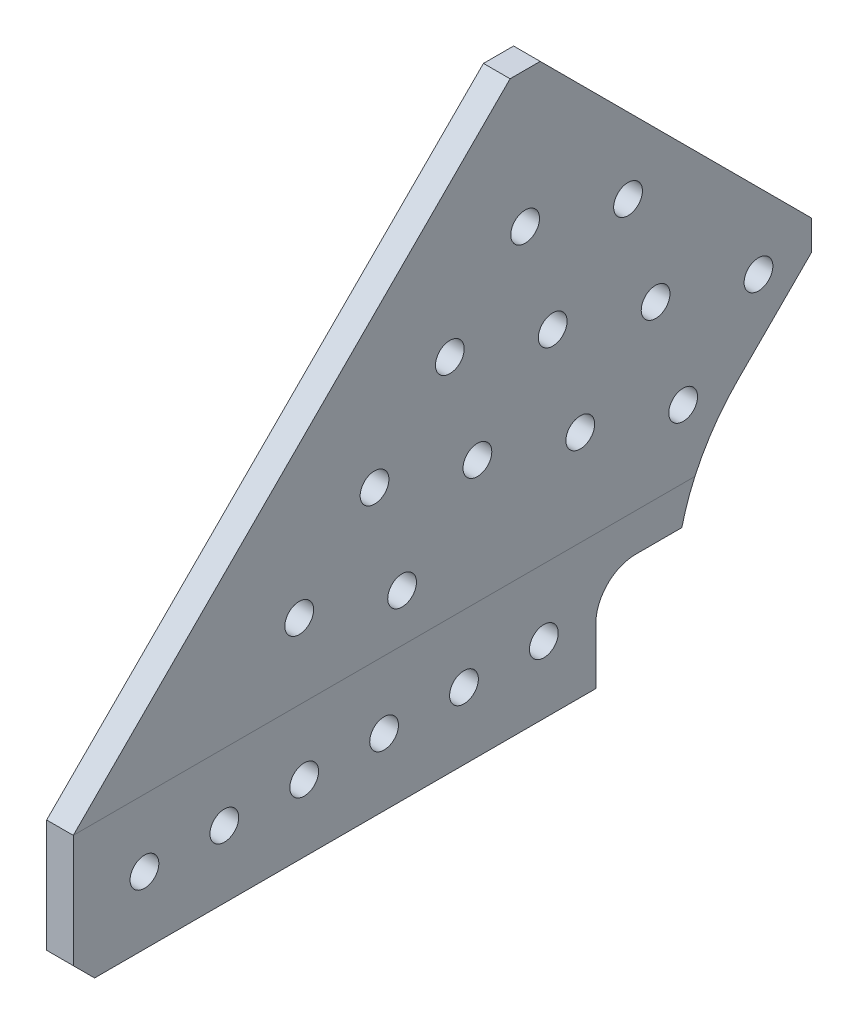
ISO-10303-21;
HEADER;
FILE_DESCRIPTION(('STEP AP214'),'2;1');
FILE_NAME('part.step','',(''),(''),'','','');
FILE_SCHEMA(('AUTOMOTIVE_DESIGN { 1 0 10303 214 1 1 1 1 }'));
ENDSEC;
DATA;
#1=APPLICATION_CONTEXT('core data for automotive mechanical design processes');
#2=APPLICATION_PROTOCOL_DEFINITION('international standard','automotive_design',2000,#1);
#3=PRODUCT_CONTEXT('',#1,'mechanical');
#4=PRODUCT('Part','Part','',(#3));
#5=PRODUCT_RELATED_PRODUCT_CATEGORY('part','',(#4));
#6=PRODUCT_DEFINITION_FORMATION('','',#4);
#7=PRODUCT_DEFINITION_CONTEXT('part definition',#1,'design');
#8=PRODUCT_DEFINITION('design','',#6,#7);
#9=PRODUCT_DEFINITION_SHAPE('','',#8);
#10=(LENGTH_UNIT() NAMED_UNIT(*) SI_UNIT(.MILLI.,.METRE.));
#11=(NAMED_UNIT(*) PLANE_ANGLE_UNIT() SI_UNIT($,.RADIAN.));
#12=(NAMED_UNIT(*) SI_UNIT($,.STERADIAN.) SOLID_ANGLE_UNIT());
#13=UNCERTAINTY_MEASURE_WITH_UNIT(LENGTH_MEASURE(1.E-05),#10,'distance_accuracy_value','');
#14=(GEOMETRIC_REPRESENTATION_CONTEXT(3) GLOBAL_UNCERTAINTY_ASSIGNED_CONTEXT((#13)) GLOBAL_UNIT_ASSIGNED_CONTEXT((#10,
#11,#12)) REPRESENTATION_CONTEXT('',''));
#15=CARTESIAN_POINT('',(0.,0.,0.));
#16=DIRECTION('',(0.,0.,1.));
#17=DIRECTION('',(1.,0.,0.));
#18=AXIS2_PLACEMENT_3D('',#15,#16,#17);
#19=CARTESIAN_POINT('',(3.175,5.48097551572336,-25.4));
#20=DIRECTION('',(1.,0.,0.));
#21=DIRECTION('',(0.,0.,-1.));
#22=AXIS2_PLACEMENT_3D('',#19,#20,#21);
#23=PLANE('',#22);
#24=DIRECTION('',(0.,0.,1.));
#25=VECTOR('',#24,1.);
#26=CARTESIAN_POINT('',(3.175,11.4935000000015,4.77130668799723));
#27=LINE('',#26,#25);
#28=CARTESIAN_POINT('',(3.175,11.4935000000015,-0.721881163144627));
#29=VERTEX_POINT('',#28);
#30=CARTESIAN_POINT('',(3.175,11.4935000000015,4.77130668799723));
#31=VERTEX_POINT('',#30);
#32=EDGE_CURVE('E183',#29,#31,#27,.T.);
#33=ORIENTED_EDGE('',*,*,#32,.F.);
#34=CARTESIAN_POINT('',(3.175,5.48097551572336,-25.4));
#35=DIRECTION('',(-1.,0.,0.));
#36=DIRECTION('',(0.,0.,-1.));
#37=AXIS2_PLACEMENT_3D('',#34,#35,#36);
#38=CIRCLE('',#37,25.4);
#39=CARTESIAN_POINT('',(3.175,16.002,-2.28143508343886));
#40=VERTEX_POINT('',#39);
#41=EDGE_CURVE('E355',#29,#40,#38,.T.);
#42=ORIENTED_EDGE('',*,*,#41,.T.);
#43=DIRECTION('',(0.,0.,1.));
#44=VECTOR('',#43,1.);
#45=CARTESIAN_POINT('',(3.175,16.002,-25.4));
#46=LINE('',#45,#44);
#47=CARTESIAN_POINT('',(3.175,16.002,71.8420489685533));
#48=VERTEX_POINT('',#47);
#49=EDGE_CURVE('E398',#40,#48,#46,.T.);
#50=ORIENTED_EDGE('',*,*,#49,.T.);
#51=DIRECTION('',(0.,-1.,0.));
#52=VECTOR('',#51,1.);
#53=CARTESIAN_POINT('',(3.175,16.002,71.8420489685533));
#54=LINE('',#53,#52);
#55=CARTESIAN_POINT('',(3.175,2.53999999999998,71.8420489685534));
#56=VERTEX_POINT('',#55);
#57=EDGE_CURVE('E369',#48,#56,#54,.T.);
#58=ORIENTED_EDGE('',*,*,#57,.T.);
#59=DIRECTION('',(0.,0.707106781186549,0.707106781186546));
#60=VECTOR('',#59,1.);
#61=CARTESIAN_POINT('',(3.175,-44.610536726415,24.6915122421386));
#62=LINE('',#61,#60);
#63=CARTESIAN_POINT('',(3.175,0.,69.3020489685534));
#64=VERTEX_POINT('',#63);
#65=EDGE_CURVE('E63',#56,#64,#62,.F.);
#66=ORIENTED_EDGE('',*,*,#65,.T.);
#67=DIRECTION('',(0.,0.,-1.));
#68=VECTOR('',#67,1.);
#69=CARTESIAN_POINT('',(3.175,0.,71.8420489685534));
#70=LINE('',#69,#68);
#71=CARTESIAN_POINT('',(3.175,0.,9.53380668799723));
#72=VERTEX_POINT('',#71);
#73=EDGE_CURVE('E349',#64,#72,#70,.T.);
#74=ORIENTED_EDGE('',*,*,#73,.T.);
#75=DIRECTION('',(0.,-1.,0.));
#76=VECTOR('',#75,1.);
#77=CARTESIAN_POINT('',(3.175,6.73100000000149,9.53380668799723));
#78=LINE('',#77,#76);
#79=CARTESIAN_POINT('',(3.175,6.73100000000149,9.53380668799723));
#80=VERTEX_POINT('',#79);
#81=EDGE_CURVE('E189',#80,#72,#78,.T.);
#82=ORIENTED_EDGE('',*,*,#81,.F.);
#83=CARTESIAN_POINT('',(3.175,6.73100000000149,4.77130668799723));
#84=DIRECTION('',(1.,0.,0.));
#85=DIRECTION('',(0.,0.,-1.));
#86=AXIS2_PLACEMENT_3D('',#83,#84,#85);
#87=CIRCLE('',#86,4.7625);
#88=EDGE_CURVE('E168',#31,#80,#87,.T.);
#89=ORIENTED_EDGE('',*,*,#88,.F.);
#90=EDGE_LOOP('',(#33,#42,#50,#58,#66,#74,#82,#89));
#91=FACE_BOUND('',#90,.T.);
#92=CARTESIAN_POINT('',(3.175,8.001,15.7303069425573));
#93=DIRECTION('',(1.,0.,0.));
#94=DIRECTION('',(0.,1.,0.));
#95=AXIS2_PLACEMENT_3D('',#92,#93,#94);
#96=CIRCLE('',#95,1.7145);
#97=CARTESIAN_POINT('',(3.175,9.7155,15.7303069425573));
#98=VERTEX_POINT('',#97);
#99=EDGE_CURVE('E307',#98,#98,#96,.T.);
#100=ORIENTED_EDGE('',*,*,#99,.F.);
#101=EDGE_LOOP('',(#100));
#102=FACE_BOUND('',#101,.T.);
#103=CARTESIAN_POINT('',(3.175,8.001,25.2553069425573));
#104=DIRECTION('',(1.,0.,0.));
#105=DIRECTION('',(0.,1.,0.));
#106=AXIS2_PLACEMENT_3D('',#103,#104,#105);
#107=CIRCLE('',#106,1.7145);
#108=CARTESIAN_POINT('',(3.175,9.7155,25.2553069425573));
#109=VERTEX_POINT('',#108);
#110=EDGE_CURVE('E315',#109,#109,#107,.T.);
#111=ORIENTED_EDGE('',*,*,#110,.F.);
#112=EDGE_LOOP('',(#111));
#113=FACE_BOUND('',#112,.T.);
#114=CARTESIAN_POINT('',(3.175,8.001,34.7803069425573));
#115=DIRECTION('',(1.,0.,0.));
#116=DIRECTION('',(0.,1.,0.));
#117=AXIS2_PLACEMENT_3D('',#114,#115,#116);
#118=CIRCLE('',#117,1.7145);
#119=CARTESIAN_POINT('',(3.175,9.7155,34.7803069425573));
#120=VERTEX_POINT('',#119);
#121=EDGE_CURVE('E322',#120,#120,#118,.T.);
#122=ORIENTED_EDGE('',*,*,#121,.F.);
#123=EDGE_LOOP('',(#122));
#124=FACE_BOUND('',#123,.T.);
#125=CARTESIAN_POINT('',(3.175,8.001,44.3053069425572));
#126=DIRECTION('',(1.,0.,0.));
#127=DIRECTION('',(0.,1.,0.));
#128=AXIS2_PLACEMENT_3D('',#125,#126,#127);
#129=CIRCLE('',#128,1.7145);
#130=CARTESIAN_POINT('',(3.175,9.7155,44.3053069425572));
#131=VERTEX_POINT('',#130);
#132=EDGE_CURVE('E330',#131,#131,#129,.T.);
#133=ORIENTED_EDGE('',*,*,#132,.F.);
#134=EDGE_LOOP('',(#133));
#135=FACE_BOUND('',#134,.T.);
#136=CARTESIAN_POINT('',(3.175,8.001,53.8303069425572));
#137=DIRECTION('',(1.,0.,0.));
#138=DIRECTION('',(0.,1.,0.));
#139=AXIS2_PLACEMENT_3D('',#136,#137,#138);
#140=CIRCLE('',#139,1.7145);
#141=CARTESIAN_POINT('',(3.175,9.7155,53.8303069425572));
#142=VERTEX_POINT('',#141);
#143=EDGE_CURVE('E338',#142,#142,#140,.T.);
#144=ORIENTED_EDGE('',*,*,#143,.F.);
#145=EDGE_LOOP('',(#144));
#146=FACE_BOUND('',#145,.T.);
#147=CARTESIAN_POINT('',(3.175,8.001,63.3553069425571));
#148=DIRECTION('',(1.,0.,0.));
#149=DIRECTION('',(0.,1.,0.));
#150=AXIS2_PLACEMENT_3D('',#147,#148,#149);
#151=CIRCLE('',#150,1.7145);
#152=CARTESIAN_POINT('',(3.175,9.7155,63.3553069425571));
#153=VERTEX_POINT('',#152);
#154=EDGE_CURVE('E211',#153,#153,#151,.T.);
#155=ORIENTED_EDGE('',*,*,#154,.F.);
#156=EDGE_LOOP('',(#155));
#157=FACE_BOUND('',#156,.T.);
#158=ADVANCED_FACE('F53',(#91,#102,#113,#124,#135,#146,#157),#23,.T.);
#159=CARTESIAN_POINT('',(3.175,0.,71.8420489685534));
#160=DIRECTION('',(0.,1.,0.));
#161=DIRECTION('',(0.,0.,1.));
#162=AXIS2_PLACEMENT_3D('',#159,#160,#161);
#163=PLANE('',#162);
#164=DIRECTION('',(0.,0.,-1.));
#165=VECTOR('',#164,1.);
#166=CARTESIAN_POINT('',(0.,0.,71.8420489685534));
#167=LINE('',#166,#165);
#168=CARTESIAN_POINT('',(0.,0.,69.3020489685534));
#169=VERTEX_POINT('',#168);
#170=CARTESIAN_POINT('',(0.,0.,9.53380668799723));
#171=VERTEX_POINT('',#170);
#172=EDGE_CURVE('E306',#169,#171,#167,.T.);
#173=ORIENTED_EDGE('',*,*,#172,.T.);
#174=DIRECTION('',(1.,0.,0.));
#175=VECTOR('',#174,1.);
#176=CARTESIAN_POINT('',(0.,0.,9.53380668799723));
#177=LINE('',#176,#175);
#178=EDGE_CURVE('E73',#171,#72,#177,.T.);
#179=ORIENTED_EDGE('',*,*,#178,.T.);
#180=ORIENTED_EDGE('',*,*,#73,.F.);
#181=DIRECTION('',(-1.,0.,0.));
#182=VECTOR('',#181,1.);
#183=CARTESIAN_POINT('',(3.175,0.,69.3020489685534));
#184=LINE('',#183,#182);
#185=EDGE_CURVE('E428',#64,#169,#184,.T.);
#186=ORIENTED_EDGE('',*,*,#185,.T.);
#187=EDGE_LOOP('',(#173,#179,#180,#186));
#188=FACE_BOUND('',#187,.T.);
#189=ADVANCED_FACE('F443',(#188),#163,.F.);
#190=CARTESIAN_POINT('',(3.175,5.48097551572336,-25.4));
#191=DIRECTION('',(-1.,0.,0.));
#192=DIRECTION('',(0.,0.,1.));
#193=AXIS2_PLACEMENT_3D('',#190,#191,#192);
#194=CYLINDRICAL_SURFACE('',#193,25.4);
#195=ORIENTED_EDGE('',*,*,#41,.F.);
#196=DIRECTION('',(1.,0.,0.));
#197=VECTOR('',#196,1.);
#198=CARTESIAN_POINT('',(0.,11.4935000000015,-0.721881163144627));
#199=LINE('',#198,#197);
#200=CARTESIAN_POINT('',(0.,11.4935000000015,-0.721881163144627));
#201=VERTEX_POINT('',#200);
#202=EDGE_CURVE('E202',#201,#29,#199,.T.);
#203=ORIENTED_EDGE('',*,*,#202,.F.);
#204=CARTESIAN_POINT('',(0.,5.48097551572336,-25.4));
#205=DIRECTION('',(-1.,0.,0.));
#206=DIRECTION('',(0.,0.,-1.));
#207=AXIS2_PLACEMENT_3D('',#204,#205,#206);
#208=CIRCLE('',#207,25.4);
#209=CARTESIAN_POINT('',(0.,23.4414877578617,-7.43948775786172));
#210=VERTEX_POINT('',#209);
#211=EDGE_CURVE('E375',#201,#210,#208,.T.);
#212=ORIENTED_EDGE('',*,*,#211,.T.);
#213=DIRECTION('',(-1.,0.,0.));
#214=VECTOR('',#213,1.);
#215=CARTESIAN_POINT('',(3.175,23.4414877578617,-7.43948775786172));
#216=LINE('',#215,#214);
#217=CARTESIAN_POINT('',(3.175,23.4414877578617,-7.43948775786172));
#218=VERTEX_POINT('',#217);
#219=EDGE_CURVE('E394',#218,#210,#216,.T.);
#220=ORIENTED_EDGE('',*,*,#219,.F.);
#221=EDGE_CURVE('E353',#40,#218,#38,.T.);
#222=ORIENTED_EDGE('',*,*,#221,.F.);
#223=EDGE_LOOP('',(#195,#203,#212,#220,#222));
#224=FACE_BOUND('',#223,.T.);
#225=ADVANCED_FACE('F476',(#224),#194,.F.);
#226=CARTESIAN_POINT('',(3.175,23.4414877578617,-7.43948775786172));
#227=DIRECTION('',(0.,0.707106781186548,0.707106781186546));
#228=DIRECTION('',(0.,-0.707106781186547,0.707106781186549));
#229=AXIS2_PLACEMENT_3D('',#226,#227,#228);
#230=PLANE('',#229);
#231=DIRECTION('',(0.,0.707106781186546,-0.707106781186549));
#232=VECTOR('',#231,1.);
#233=CARTESIAN_POINT('',(0.,23.4414877578617,-7.43948775786172));
#234=LINE('',#233,#232);
#235=CARTESIAN_POINT('',(0.,32.1664610179245,-16.1644610179245));
#236=VERTEX_POINT('',#235);
#237=EDGE_CURVE('E378',#210,#236,#234,.T.);
#238=ORIENTED_EDGE('',*,*,#237,.T.);
#239=DIRECTION('',(1.,0.,0.));
#240=VECTOR('',#239,1.);
#241=CARTESIAN_POINT('',(3.175,32.1664610179245,-16.1644610179245));
#242=LINE('',#241,#240);
#243=CARTESIAN_POINT('',(3.175,32.1664610179245,-16.1644610179245));
#244=VERTEX_POINT('',#243);
#245=EDGE_CURVE('E12',#236,#244,#242,.T.);
#246=ORIENTED_EDGE('',*,*,#245,.T.);
#247=DIRECTION('',(0.,0.707106781186546,-0.707106781186549));
#248=VECTOR('',#247,1.);
#249=CARTESIAN_POINT('',(3.175,23.4414877578617,-7.43948775786172));
#250=LINE('',#249,#248);
#251=EDGE_CURVE('E358',#218,#244,#250,.T.);
#252=ORIENTED_EDGE('',*,*,#251,.F.);
#253=ORIENTED_EDGE('',*,*,#219,.T.);
#254=EDGE_LOOP('',(#238,#246,#252,#253));
#255=FACE_BOUND('',#254,.T.);
#256=ADVANCED_FACE('F470',(#255),#230,.F.);
#257=CARTESIAN_POINT('',(3.175,69.8835367264149,17.9605122421382));
#258=DIRECTION('',(0.,-0.707106781186547,0.707106781186548));
#259=DIRECTION('',(0.,-0.707106781186548,-0.707106781186547));
#260=AXIS2_PLACEMENT_3D('',#257,#258,#259);
#261=PLANE('',#260);
#262=DIRECTION('',(0.,0.707106781186548,0.707106781186547));
#263=VECTOR('',#262,1.);
#264=CARTESIAN_POINT('',(0.,69.8835367264149,17.9605122421382));
#265=LINE('',#264,#263);
#266=CARTESIAN_POINT('',(0.,35.7585634663521,-16.1644610179245));
#267=VERTEX_POINT('',#266);
#268=CARTESIAN_POINT('',(0.,68.0874855022011,16.1644610179244));
#269=VERTEX_POINT('',#268);
#270=EDGE_CURVE('E382',#267,#269,#265,.T.);
#271=ORIENTED_EDGE('',*,*,#270,.T.);
#272=DIRECTION('',(1.,0.,0.));
#273=VECTOR('',#272,1.);
#274=CARTESIAN_POINT('',(3.175,68.0874855022011,16.1644610179244));
#275=LINE('',#274,#273);
#276=CARTESIAN_POINT('',(3.175,68.0874855022011,16.1644610179244));
#277=VERTEX_POINT('',#276);
#278=EDGE_CURVE('E419',#269,#277,#275,.T.);
#279=ORIENTED_EDGE('',*,*,#278,.T.);
#280=DIRECTION('',(0.,0.707106781186548,0.707106781186547));
#281=VECTOR('',#280,1.);
#282=CARTESIAN_POINT('',(3.175,69.8835367264149,17.9605122421382));
#283=LINE('',#282,#281);
#284=CARTESIAN_POINT('',(3.175,35.7585634663521,-16.1644610179245));
#285=VERTEX_POINT('',#284);
#286=EDGE_CURVE('E362',#285,#277,#283,.T.);
#287=ORIENTED_EDGE('',*,*,#286,.F.);
#288=DIRECTION('',(-1.,0.,0.));
#289=VECTOR('',#288,1.);
#290=CARTESIAN_POINT('',(3.175,35.7585634663521,-16.1644610179245));
#291=LINE('',#290,#289);
#292=EDGE_CURVE('E415',#285,#267,#291,.T.);
#293=ORIENTED_EDGE('',*,*,#292,.T.);
#294=EDGE_LOOP('',(#271,#279,#287,#293));
#295=FACE_BOUND('',#294,.T.);
#296=ADVANCED_FACE('F457',(#295),#261,.F.);
#297=CARTESIAN_POINT('',(3.175,69.8835367264149,17.9605122421382));
#298=DIRECTION('',(0.,-0.707106781186549,-0.707106781186546));
#299=DIRECTION('',(0.,0.707106781186546,-0.707106781186549));
#300=AXIS2_PLACEMENT_3D('',#297,#298,#299);
#301=PLANE('',#300);
#302=DIRECTION('',(0.,-0.707106781186546,0.707106781186549));
#303=VECTOR('',#302,1.);
#304=CARTESIAN_POINT('',(3.175,69.8835367264149,17.9605122421382));
#305=LINE('',#304,#303);
#306=CARTESIAN_POINT('',(3.175,68.0874855022011,19.7565634663521));
#307=VERTEX_POINT('',#306);
#308=EDGE_CURVE('E366',#307,#48,#305,.T.);
#309=ORIENTED_EDGE('',*,*,#308,.F.);
#310=DIRECTION('',(-1.,0.,0.));
#311=VECTOR('',#310,1.);
#312=CARTESIAN_POINT('',(3.175,68.0874855022011,19.7565634663521));
#313=LINE('',#312,#311);
#314=CARTESIAN_POINT('',(0.,68.0874855022011,19.7565634663521));
#315=VERTEX_POINT('',#314);
#316=EDGE_CURVE('E402',#307,#315,#313,.T.);
#317=ORIENTED_EDGE('',*,*,#316,.T.);
#318=DIRECTION('',(0.,-0.707106781186546,0.707106781186549));
#319=VECTOR('',#318,1.);
#320=CARTESIAN_POINT('',(0.,69.8835367264149,17.9605122421382));
#321=LINE('',#320,#319);
#322=CARTESIAN_POINT('',(0.,16.002,71.8420489685533));
#323=VERTEX_POINT('',#322);
#324=EDGE_CURVE('E386',#315,#323,#321,.T.);
#325=ORIENTED_EDGE('',*,*,#324,.T.);
#326=DIRECTION('',(-1.,0.,0.));
#327=VECTOR('',#326,1.);
#328=CARTESIAN_POINT('',(3.175,16.002,71.8420489685533));
#329=LINE('',#328,#327);
#330=EDGE_CURVE('E372',#48,#323,#329,.T.);
#331=ORIENTED_EDGE('',*,*,#330,.F.);
#332=EDGE_LOOP('',(#309,#317,#325,#331));
#333=FACE_BOUND('',#332,.T.);
#334=ADVANCED_FACE('F451',(#333),#301,.F.);
#335=CARTESIAN_POINT('',(3.175,16.002,71.8420489685533));
#336=DIRECTION('',(0.,0.,-1.));
#337=DIRECTION('',(0.,1.,0.));
#338=AXIS2_PLACEMENT_3D('',#335,#336,#337);
#339=PLANE('',#338);
#340=DIRECTION('',(0.,-1.,0.));
#341=VECTOR('',#340,1.);
#342=CARTESIAN_POINT('',(0.,16.002,71.8420489685533));
#343=LINE('',#342,#341);
#344=CARTESIAN_POINT('',(0.,2.53999999999998,71.8420489685534));
#345=VERTEX_POINT('',#344);
#346=EDGE_CURVE('E354',#323,#345,#343,.T.);
#347=ORIENTED_EDGE('',*,*,#346,.T.);
#348=DIRECTION('',(1.,0.,0.));
#349=VECTOR('',#348,1.);
#350=CARTESIAN_POINT('',(3.175,2.53999999999998,71.8420489685534));
#351=LINE('',#350,#349);
#352=EDGE_CURVE('E81',#345,#56,#351,.T.);
#353=ORIENTED_EDGE('',*,*,#352,.T.);
#354=ORIENTED_EDGE('',*,*,#57,.F.);
#355=ORIENTED_EDGE('',*,*,#330,.T.);
#356=EDGE_LOOP('',(#347,#353,#354,#355));
#357=FACE_BOUND('',#356,.T.);
#358=ADVANCED_FACE('F447',(#357),#339,.F.);
#359=CARTESIAN_POINT('',(3.175,24.9822561210693,44.9012806053457));
#360=DIRECTION('',(1.,0.,0.));
#361=DIRECTION('',(0.,1.,0.));
#362=AXIS2_PLACEMENT_3D('',#359,#360,#361);
#363=CIRCLE('',#362,1.7145);
#364=CARTESIAN_POINT('',(3.175,26.6967561210693,44.9012806053457));
#365=VERTEX_POINT('',#364);
#366=EDGE_CURVE('E212',#365,#365,#363,.T.);
#367=ORIENTED_EDGE('',*,*,#366,.F.);
#368=EDGE_LOOP('',(#367));
#369=FACE_BOUND('',#368,.T.);
#370=CARTESIAN_POINT('',(3.175,36.3687646176033,2.40625237546517));
#371=DIRECTION('',(1.,0.,0.));
#372=DIRECTION('',(0.,1.,0.));
#373=AXIS2_PLACEMENT_3D('',#370,#371,#372);
#374=CIRCLE('',#373,1.7145);
#375=CARTESIAN_POINT('',(3.175,38.0832646176033,2.40625237546517));
#376=VERTEX_POINT('',#375);
#377=EDGE_CURVE('E230',#376,#376,#374,.T.);
#378=ORIENTED_EDGE('',*,*,#377,.F.);
#379=EDGE_LOOP('',(#378));
#380=FACE_BOUND('',#379,.T.);
#381=CARTESIAN_POINT('',(3.175,51.9230244842766,17.9605122421383));
#382=DIRECTION('',(1.,0.,0.));
#383=DIRECTION('',(0.,1.,0.));
#384=AXIS2_PLACEMENT_3D('',#381,#382,#383);
#385=CIRCLE('',#384,1.7145);
#386=CARTESIAN_POINT('',(3.175,53.6375244842766,17.9605122421383));
#387=VERTEX_POINT('',#386);
#388=EDGE_CURVE('E221',#387,#387,#385,.T.);
#389=ORIENTED_EDGE('',*,*,#388,.F.);
#390=EDGE_LOOP('',(#389));
#391=FACE_BOUND('',#390,.T.);
#392=CARTESIAN_POINT('',(3.175,48.6360226114745,5.69325424826719));
#393=DIRECTION('',(1.,0.,0.));
#394=DIRECTION('',(0.,1.,0.));
#395=AXIS2_PLACEMENT_3D('',#392,#393,#394);
#396=CIRCLE('',#395,1.7145);
#397=CARTESIAN_POINT('',(3.175,50.3505226114745,5.69325424826719));
#398=VERTEX_POINT('',#397);
#399=EDGE_CURVE('E201',#398,#398,#396,.T.);
#400=ORIENTED_EDGE('',*,*,#399,.F.);
#401=EDGE_LOOP('',(#400));
#402=FACE_BOUND('',#401,.T.);
#403=CARTESIAN_POINT('',(3.175,21.6952542482672,32.6340226114746));
#404=DIRECTION('',(1.,0.,0.));
#405=DIRECTION('',(0.,1.,0.));
#406=AXIS2_PLACEMENT_3D('',#403,#404,#405);
#407=CIRCLE('',#406,1.7145);
#408=CARTESIAN_POINT('',(3.175,23.4097542482672,32.6340226114746));
#409=VERTEX_POINT('',#408);
#410=EDGE_CURVE('E276',#409,#409,#407,.T.);
#411=ORIENTED_EDGE('',*,*,#410,.F.);
#412=EDGE_LOOP('',(#411));
#413=FACE_BOUND('',#412,.T.);
#414=CARTESIAN_POINT('',(3.175,30.6755103693363,23.6537664904055));
#415=DIRECTION('',(1.,0.,0.));
#416=DIRECTION('',(0.,1.,0.));
#417=AXIS2_PLACEMENT_3D('',#414,#415,#416);
#418=CIRCLE('',#417,1.7145);
#419=CARTESIAN_POINT('',(3.175,32.3900103693363,23.6537664904055));
#420=VERTEX_POINT('',#419);
#421=EDGE_CURVE('E284',#420,#420,#418,.T.);
#422=ORIENTED_EDGE('',*,*,#421,.F.);
#423=EDGE_LOOP('',(#422));
#424=FACE_BOUND('',#423,.T.);
#425=CARTESIAN_POINT('',(3.175,27.3885084965342,11.3865084965343));
#426=DIRECTION('',(1.,0.,0.));
#427=DIRECTION('',(0.,1.,0.));
#428=AXIS2_PLACEMENT_3D('',#425,#426,#427);
#429=CIRCLE('',#428,1.7145);
#430=CARTESIAN_POINT('',(3.175,29.1030084965342,11.3865084965343));
#431=VERTEX_POINT('',#430);
#432=EDGE_CURVE('E291',#431,#431,#429,.T.);
#433=ORIENTED_EDGE('',*,*,#432,.F.);
#434=EDGE_LOOP('',(#433));
#435=FACE_BOUND('',#434,.T.);
#436=CARTESIAN_POINT('',(3.175,24.1015066237322,-0.880749497336852));
#437=DIRECTION('',(1.,0.,0.));
#438=DIRECTION('',(0.,1.,0.));
#439=AXIS2_PLACEMENT_3D('',#436,#437,#438);
#440=CIRCLE('',#439,1.7145);
#441=CARTESIAN_POINT('',(3.175,25.8160066237322,-0.880749497336852));
#442=VERTEX_POINT('',#441);
#443=EDGE_CURVE('E245',#442,#442,#440,.T.);
#444=ORIENTED_EDGE('',*,*,#443,.F.);
#445=EDGE_LOOP('',(#444));
#446=FACE_BOUND('',#445,.T.);
#447=CARTESIAN_POINT('',(3.175,33.0817627448013,-9.86100561840598));
#448=DIRECTION('',(1.,0.,0.));
#449=DIRECTION('',(0.,1.,0.));
#450=AXIS2_PLACEMENT_3D('',#447,#448,#449);
#451=CIRCLE('',#450,1.7145);
#452=CARTESIAN_POINT('',(3.175,34.7962627448013,-9.86100561840598));
#453=VERTEX_POINT('',#452);
#454=EDGE_CURVE('E246',#453,#453,#451,.T.);
#455=ORIENTED_EDGE('',*,*,#454,.F.);
#456=EDGE_LOOP('',(#455));
#457=FACE_BOUND('',#456,.T.);
#458=CARTESIAN_POINT('',(3.175,33.9625122421384,35.9210244842766));
#459=DIRECTION('',(1.,0.,0.));
#460=DIRECTION('',(0.,1.,0.));
#461=AXIS2_PLACEMENT_3D('',#458,#459,#460);
#462=CIRCLE('',#461,1.7145);
#463=CARTESIAN_POINT('',(3.175,35.6770122421384,35.9210244842766));
#464=VERTEX_POINT('',#463);
#465=EDGE_CURVE('E254',#464,#464,#462,.T.);
#466=ORIENTED_EDGE('',*,*,#465,.F.);
#467=EDGE_LOOP('',(#466));
#468=FACE_BOUND('',#467,.T.);
#469=CARTESIAN_POINT('',(3.175,42.9427683632075,26.9407683632075));
#470=DIRECTION('',(1.,0.,0.));
#471=DIRECTION('',(0.,1.,0.));
#472=AXIS2_PLACEMENT_3D('',#469,#470,#471);
#473=CIRCLE('',#472,1.7145);
#474=CARTESIAN_POINT('',(3.175,44.6572683632075,26.9407683632075));
#475=VERTEX_POINT('',#474);
#476=EDGE_CURVE('E262',#475,#475,#473,.T.);
#477=ORIENTED_EDGE('',*,*,#476,.F.);
#478=EDGE_LOOP('',(#477));
#479=FACE_BOUND('',#478,.T.);
#480=CARTESIAN_POINT('',(3.175,39.6557664904054,14.6735103693363));
#481=DIRECTION('',(1.,0.,0.));
#482=DIRECTION('',(0.,1.,0.));
#483=AXIS2_PLACEMENT_3D('',#480,#481,#482);
#484=CIRCLE('',#483,1.7145);
#485=CARTESIAN_POINT('',(3.175,41.3702664904054,14.6735103693363));
#486=VERTEX_POINT('',#485);
#487=EDGE_CURVE('E229',#486,#486,#484,.T.);
#488=ORIENTED_EDGE('',*,*,#487,.F.);
#489=EDGE_LOOP('',(#488));
#490=FACE_BOUND('',#489,.T.);
#491=ORIENTED_EDGE('',*,*,#286,.T.);
#492=DIRECTION('',(0.,0.,-1.));
#493=VECTOR('',#492,1.);
#494=CARTESIAN_POINT('',(3.175,68.0874855022011,-25.4));
#495=LINE('',#494,#493);
#496=EDGE_CURVE('E425',#277,#307,#495,.F.);
#497=ORIENTED_EDGE('',*,*,#496,.T.);
#498=ORIENTED_EDGE('',*,*,#308,.T.);
#499=ORIENTED_EDGE('',*,*,#49,.F.);
#500=ORIENTED_EDGE('',*,*,#221,.T.);
#501=ORIENTED_EDGE('',*,*,#251,.T.);
#502=DIRECTION('',(0.,-1.,0.));
#503=VECTOR('',#502,1.);
#504=CARTESIAN_POINT('',(3.175,5.48097551572337,-16.1644610179245));
#505=LINE('',#504,#503);
#506=EDGE_CURVE('E422',#244,#285,#505,.F.);
#507=ORIENTED_EDGE('',*,*,#506,.T.);
#508=EDGE_LOOP('',(#491,#497,#498,#499,#500,#501,#507));
#509=FACE_BOUND('',#508,.T.);
#510=ADVANCED_FACE('F463',(#369,#380,#391,#402,#413,#424,#435,#446,#457,#468,#479,#490,#509),
#23,.T.);
#511=CARTESIAN_POINT('',(0.,5.48097551572336,-25.4));
#512=DIRECTION('',(1.,0.,0.));
#513=DIRECTION('',(0.,0.,-1.));
#514=AXIS2_PLACEMENT_3D('',#511,#512,#513);
#515=PLANE('',#514);
#516=CARTESIAN_POINT('',(0.,24.9822561210693,44.9012806053457));
#517=DIRECTION('',(1.,0.,0.));
#518=DIRECTION('',(0.,1.,0.));
#519=AXIS2_PLACEMENT_3D('',#516,#517,#518);
#520=CIRCLE('',#519,1.7145);
#521=CARTESIAN_POINT('',(0.,26.6967561210693,44.9012806053457));
#522=VERTEX_POINT('',#521);
#523=EDGE_CURVE('E207',#522,#522,#520,.T.);
#524=ORIENTED_EDGE('',*,*,#523,.T.);
#525=EDGE_LOOP('',(#524));
#526=FACE_BOUND('',#525,.T.);
#527=CARTESIAN_POINT('',(0.,36.3687646176033,2.40625237546517));
#528=DIRECTION('',(1.,0.,0.));
#529=DIRECTION('',(0.,1.,0.));
#530=AXIS2_PLACEMENT_3D('',#527,#528,#529);
#531=CIRCLE('',#530,1.7145);
#532=CARTESIAN_POINT('',(0.,38.0832646176033,2.40625237546517));
#533=VERTEX_POINT('',#532);
#534=EDGE_CURVE('E225',#533,#533,#531,.T.);
#535=ORIENTED_EDGE('',*,*,#534,.T.);
#536=EDGE_LOOP('',(#535));
#537=FACE_BOUND('',#536,.T.);
#538=CARTESIAN_POINT('',(0.,51.9230244842766,17.9605122421383));
#539=DIRECTION('',(1.,0.,0.));
#540=DIRECTION('',(0.,1.,0.));
#541=AXIS2_PLACEMENT_3D('',#538,#539,#540);
#542=CIRCLE('',#541,1.7145);
#543=CARTESIAN_POINT('',(0.,53.6375244842766,17.9605122421383));
#544=VERTEX_POINT('',#543);
#545=EDGE_CURVE('E234',#544,#544,#542,.T.);
#546=ORIENTED_EDGE('',*,*,#545,.T.);
#547=EDGE_LOOP('',(#546));
#548=FACE_BOUND('',#547,.T.);
#549=CARTESIAN_POINT('',(0.,48.6360226114745,5.69325424826719));
#550=DIRECTION('',(1.,0.,0.));
#551=DIRECTION('',(0.,1.,0.));
#552=AXIS2_PLACEMENT_3D('',#549,#550,#551);
#553=CIRCLE('',#552,1.7145);
#554=CARTESIAN_POINT('',(0.,50.3505226114745,5.69325424826719));
#555=VERTEX_POINT('',#554);
#556=EDGE_CURVE('E217',#555,#555,#553,.T.);
#557=ORIENTED_EDGE('',*,*,#556,.T.);
#558=EDGE_LOOP('',(#557));
#559=FACE_BOUND('',#558,.T.);
#560=CARTESIAN_POINT('',(0.,21.6952542482672,32.6340226114746));
#561=DIRECTION('',(1.,0.,0.));
#562=DIRECTION('',(0.,1.,0.));
#563=AXIS2_PLACEMENT_3D('',#560,#561,#562);
#564=CIRCLE('',#563,1.7145);
#565=CARTESIAN_POINT('',(0.,23.4097542482672,32.6340226114746));
#566=VERTEX_POINT('',#565);
#567=EDGE_CURVE('E216',#566,#566,#564,.T.);
#568=ORIENTED_EDGE('',*,*,#567,.T.);
#569=EDGE_LOOP('',(#568));
#570=FACE_BOUND('',#569,.T.);
#571=CARTESIAN_POINT('',(0.,30.6755103693363,23.6537664904055));
#572=DIRECTION('',(1.,0.,0.));
#573=DIRECTION('',(0.,1.,0.));
#574=AXIS2_PLACEMENT_3D('',#571,#572,#573);
#575=CIRCLE('',#574,1.7145);
#576=CARTESIAN_POINT('',(0.,32.3900103693363,23.6537664904055));
#577=VERTEX_POINT('',#576);
#578=EDGE_CURVE('E280',#577,#577,#575,.T.);
#579=ORIENTED_EDGE('',*,*,#578,.T.);
#580=EDGE_LOOP('',(#579));
#581=FACE_BOUND('',#580,.T.);
#582=CARTESIAN_POINT('',(0.,27.3885084965342,11.3865084965343));
#583=DIRECTION('',(1.,0.,0.));
#584=DIRECTION('',(0.,1.,0.));
#585=AXIS2_PLACEMENT_3D('',#582,#583,#584);
#586=CIRCLE('',#585,1.7145);
#587=CARTESIAN_POINT('',(0.,29.1030084965342,11.3865084965343));
#588=VERTEX_POINT('',#587);
#589=EDGE_CURVE('E288',#588,#588,#586,.T.);
#590=ORIENTED_EDGE('',*,*,#589,.T.);
#591=EDGE_LOOP('',(#590));
#592=FACE_BOUND('',#591,.T.);
#593=CARTESIAN_POINT('',(0.,24.1015066237322,-0.880749497336852));
#594=DIRECTION('',(1.,0.,0.));
#595=DIRECTION('',(0.,1.,0.));
#596=AXIS2_PLACEMENT_3D('',#593,#594,#595);
#597=CIRCLE('',#596,1.7145);
#598=CARTESIAN_POINT('',(0.,25.8160066237322,-0.880749497336852));
#599=VERTEX_POINT('',#598);
#600=EDGE_CURVE('E295',#599,#599,#597,.T.);
#601=ORIENTED_EDGE('',*,*,#600,.T.);
#602=EDGE_LOOP('',(#601));
#603=FACE_BOUND('',#602,.T.);
#604=CARTESIAN_POINT('',(0.,33.0817627448013,-9.86100561840598));
#605=DIRECTION('',(1.,0.,0.));
#606=DIRECTION('',(0.,1.,0.));
#607=AXIS2_PLACEMENT_3D('',#604,#605,#606);
#608=CIRCLE('',#607,1.7145);
#609=CARTESIAN_POINT('',(0.,34.7962627448013,-9.86100561840598));
#610=VERTEX_POINT('',#609);
#611=EDGE_CURVE('E241',#610,#610,#608,.T.);
#612=ORIENTED_EDGE('',*,*,#611,.T.);
#613=EDGE_LOOP('',(#612));
#614=FACE_BOUND('',#613,.T.);
#615=CARTESIAN_POINT('',(0.,33.9625122421384,35.9210244842766));
#616=DIRECTION('',(1.,0.,0.));
#617=DIRECTION('',(0.,1.,0.));
#618=AXIS2_PLACEMENT_3D('',#615,#616,#617);
#619=CIRCLE('',#618,1.7145);
#620=CARTESIAN_POINT('',(0.,35.6770122421384,35.9210244842766));
#621=VERTEX_POINT('',#620);
#622=EDGE_CURVE('E250',#621,#621,#619,.T.);
#623=ORIENTED_EDGE('',*,*,#622,.T.);
#624=EDGE_LOOP('',(#623));
#625=FACE_BOUND('',#624,.T.);
#626=CARTESIAN_POINT('',(0.,42.9427683632075,26.9407683632075));
#627=DIRECTION('',(1.,0.,0.));
#628=DIRECTION('',(0.,1.,0.));
#629=AXIS2_PLACEMENT_3D('',#626,#627,#628);
#630=CIRCLE('',#629,1.7145);
#631=CARTESIAN_POINT('',(0.,44.6572683632075,26.9407683632075));
#632=VERTEX_POINT('',#631);
#633=EDGE_CURVE('E258',#632,#632,#630,.T.);
#634=ORIENTED_EDGE('',*,*,#633,.T.);
#635=EDGE_LOOP('',(#634));
#636=FACE_BOUND('',#635,.T.);
#637=CARTESIAN_POINT('',(0.,39.6557664904054,14.6735103693363));
#638=DIRECTION('',(1.,0.,0.));
#639=DIRECTION('',(0.,1.,0.));
#640=AXIS2_PLACEMENT_3D('',#637,#638,#639);
#641=CIRCLE('',#640,1.7145);
#642=CARTESIAN_POINT('',(0.,41.3702664904054,14.6735103693363));
#643=VERTEX_POINT('',#642);
#644=EDGE_CURVE('E266',#643,#643,#641,.T.);
#645=ORIENTED_EDGE('',*,*,#644,.T.);
#646=EDGE_LOOP('',(#645));
#647=FACE_BOUND('',#646,.T.);
#648=CARTESIAN_POINT('',(0.,8.001,15.7303069425573));
#649=DIRECTION('',(1.,0.,0.));
#650=DIRECTION('',(0.,1.,0.));
#651=AXIS2_PLACEMENT_3D('',#648,#649,#650);
#652=CIRCLE('',#651,1.7145);
#653=CARTESIAN_POINT('',(0.,9.7155,15.7303069425573));
#654=VERTEX_POINT('',#653);
#655=EDGE_CURVE('E302',#654,#654,#652,.T.);
#656=ORIENTED_EDGE('',*,*,#655,.T.);
#657=EDGE_LOOP('',(#656));
#658=FACE_BOUND('',#657,.T.);
#659=CARTESIAN_POINT('',(0.,8.001,25.2553069425573));
#660=DIRECTION('',(1.,0.,0.));
#661=DIRECTION('',(0.,1.,0.));
#662=AXIS2_PLACEMENT_3D('',#659,#660,#661);
#663=CIRCLE('',#662,1.7145);
#664=CARTESIAN_POINT('',(0.,9.7155,25.2553069425573));
#665=VERTEX_POINT('',#664);
#666=EDGE_CURVE('E311',#665,#665,#663,.T.);
#667=ORIENTED_EDGE('',*,*,#666,.T.);
#668=EDGE_LOOP('',(#667));
#669=FACE_BOUND('',#668,.T.);
#670=CARTESIAN_POINT('',(0.,8.001,34.7803069425573));
#671=DIRECTION('',(1.,0.,0.));
#672=DIRECTION('',(0.,1.,0.));
#673=AXIS2_PLACEMENT_3D('',#670,#671,#672);
#674=CIRCLE('',#673,1.7145);
#675=CARTESIAN_POINT('',(0.,9.7155,34.7803069425573));
#676=VERTEX_POINT('',#675);
#677=EDGE_CURVE('E318',#676,#676,#674,.T.);
#678=ORIENTED_EDGE('',*,*,#677,.T.);
#679=EDGE_LOOP('',(#678));
#680=FACE_BOUND('',#679,.T.);
#681=CARTESIAN_POINT('',(0.,8.001,44.3053069425572));
#682=DIRECTION('',(1.,0.,0.));
#683=DIRECTION('',(0.,1.,0.));
#684=AXIS2_PLACEMENT_3D('',#681,#682,#683);
#685=CIRCLE('',#684,1.7145);
#686=CARTESIAN_POINT('',(0.,9.7155,44.3053069425572));
#687=VERTEX_POINT('',#686);
#688=EDGE_CURVE('E326',#687,#687,#685,.T.);
#689=ORIENTED_EDGE('',*,*,#688,.T.);
#690=EDGE_LOOP('',(#689));
#691=FACE_BOUND('',#690,.T.);
#692=CARTESIAN_POINT('',(0.,8.001,53.8303069425572));
#693=DIRECTION('',(1.,0.,0.));
#694=DIRECTION('',(0.,1.,0.));
#695=AXIS2_PLACEMENT_3D('',#692,#693,#694);
#696=CIRCLE('',#695,1.7145);
#697=CARTESIAN_POINT('',(0.,9.7155,53.8303069425572));
#698=VERTEX_POINT('',#697);
#699=EDGE_CURVE('E334',#698,#698,#696,.T.);
#700=ORIENTED_EDGE('',*,*,#699,.T.);
#701=EDGE_LOOP('',(#700));
#702=FACE_BOUND('',#701,.T.);
#703=CARTESIAN_POINT('',(0.,8.001,63.3553069425571));
#704=DIRECTION('',(1.,0.,0.));
#705=DIRECTION('',(0.,1.,0.));
#706=AXIS2_PLACEMENT_3D('',#703,#704,#705);
#707=CIRCLE('',#706,1.7145);
#708=CARTESIAN_POINT('',(0.,9.7155,63.3553069425571));
#709=VERTEX_POINT('',#708);
#710=EDGE_CURVE('E342',#709,#709,#707,.T.);
#711=ORIENTED_EDGE('',*,*,#710,.T.);
#712=EDGE_LOOP('',(#711));
#713=FACE_BOUND('',#712,.T.);
#714=ORIENTED_EDGE('',*,*,#211,.F.);
#715=DIRECTION('',(0.,0.,1.));
#716=VECTOR('',#715,1.);
#717=CARTESIAN_POINT('',(0.,11.4935000000015,4.77130668799723));
#718=LINE('',#717,#716);
#719=CARTESIAN_POINT('',(0.,11.4935000000015,4.77130668799723));
#720=VERTEX_POINT('',#719);
#721=EDGE_CURVE('E171',#201,#720,#718,.T.);
#722=ORIENTED_EDGE('',*,*,#721,.T.);
#723=CARTESIAN_POINT('',(0.,6.73100000000149,4.77130668799723));
#724=DIRECTION('',(1.,0.,0.));
#725=DIRECTION('',(0.,0.,-1.));
#726=AXIS2_PLACEMENT_3D('',#723,#724,#725);
#727=CIRCLE('',#726,4.7625);
#728=CARTESIAN_POINT('',(0.,6.73100000000149,9.53380668799723));
#729=VERTEX_POINT('',#728);
#730=EDGE_CURVE('E165',#720,#729,#727,.T.);
#731=ORIENTED_EDGE('',*,*,#730,.T.);
#732=DIRECTION('',(0.,-1.,0.));
#733=VECTOR('',#732,1.);
#734=CARTESIAN_POINT('',(0.,6.73100000000149,9.53380668799723));
#735=LINE('',#734,#733);
#736=EDGE_CURVE('E173',#729,#171,#735,.T.);
#737=ORIENTED_EDGE('',*,*,#736,.T.);
#738=ORIENTED_EDGE('',*,*,#172,.F.);
#739=DIRECTION('',(0.,-0.707106781186549,-0.707106781186546));
#740=VECTOR('',#739,1.);
#741=CARTESIAN_POINT('',(0.,0.,69.3020489685534));
#742=LINE('',#741,#740);
#743=EDGE_CURVE('E409',#169,#345,#742,.F.);
#744=ORIENTED_EDGE('',*,*,#743,.T.);
#745=ORIENTED_EDGE('',*,*,#346,.F.);
#746=ORIENTED_EDGE('',*,*,#324,.F.);
#747=DIRECTION('',(0.,0.,1.));
#748=VECTOR('',#747,1.);
#749=CARTESIAN_POINT('',(0.,68.0874855022011,19.7565634663521));
#750=LINE('',#749,#748);
#751=EDGE_CURVE('E412',#315,#269,#750,.F.);
#752=ORIENTED_EDGE('',*,*,#751,.T.);
#753=ORIENTED_EDGE('',*,*,#270,.F.);
#754=DIRECTION('',(0.,1.,0.));
#755=VECTOR('',#754,1.);
#756=CARTESIAN_POINT('',(0.,35.7585634663521,-16.1644610179245));
#757=LINE('',#756,#755);
#758=EDGE_CURVE('E406',#267,#236,#757,.F.);
#759=ORIENTED_EDGE('',*,*,#758,.T.);
#760=ORIENTED_EDGE('',*,*,#237,.F.);
#761=EDGE_LOOP('',(#714,#722,#731,#737,#738,#744,#745,#746,#752,#753,#759,#760));
#762=FACE_BOUND('',#761,.T.);
#763=ADVANCED_FACE('F181',(#526,#537,#548,#559,#570,#581,#592,#603,#614,#625,#636,#647,#658,
#669,#680,#691,#702,#713,#762),#515,.F.);
#764=CARTESIAN_POINT('',(0.,8.001,63.3553069425571));
#765=DIRECTION('',(1.,0.,0.));
#766=DIRECTION('',(0.,0.,-1.));
#767=AXIS2_PLACEMENT_3D('',#764,#765,#766);
#768=CYLINDRICAL_SURFACE('',#767,1.7145);
#769=ORIENTED_EDGE('',*,*,#710,.F.);
#770=EDGE_LOOP('',(#769));
#771=FACE_BOUND('',#770,.T.);
#772=ORIENTED_EDGE('',*,*,#154,.T.);
#773=EDGE_LOOP('',(#772));
#774=FACE_BOUND('',#773,.T.);
#775=ADVANCED_FACE('F597',(#771,#774),#768,.F.);
#776=CARTESIAN_POINT('',(0.,8.001,53.8303069425572));
#777=DIRECTION('',(1.,0.,0.));
#778=DIRECTION('',(0.,0.,-1.));
#779=AXIS2_PLACEMENT_3D('',#776,#777,#778);
#780=CYLINDRICAL_SURFACE('',#779,1.7145);
#781=ORIENTED_EDGE('',*,*,#699,.F.);
#782=EDGE_LOOP('',(#781));
#783=FACE_BOUND('',#782,.T.);
#784=ORIENTED_EDGE('',*,*,#143,.T.);
#785=EDGE_LOOP('',(#784));
#786=FACE_BOUND('',#785,.T.);
#787=ADVANCED_FACE('F671',(#783,#786),#780,.F.);
#788=CARTESIAN_POINT('',(0.,8.001,44.3053069425572));
#789=DIRECTION('',(1.,0.,0.));
#790=DIRECTION('',(0.,0.,-1.));
#791=AXIS2_PLACEMENT_3D('',#788,#789,#790);
#792=CYLINDRICAL_SURFACE('',#791,1.7145);
#793=ORIENTED_EDGE('',*,*,#688,.F.);
#794=EDGE_LOOP('',(#793));
#795=FACE_BOUND('',#794,.T.);
#796=ORIENTED_EDGE('',*,*,#132,.T.);
#797=EDGE_LOOP('',(#796));
#798=FACE_BOUND('',#797,.T.);
#799=ADVANCED_FACE('F667',(#795,#798),#792,.F.);
#800=CARTESIAN_POINT('',(0.,8.001,34.7803069425573));
#801=DIRECTION('',(1.,0.,0.));
#802=DIRECTION('',(0.,0.,-1.));
#803=AXIS2_PLACEMENT_3D('',#800,#801,#802);
#804=CYLINDRICAL_SURFACE('',#803,1.7145);
#805=ORIENTED_EDGE('',*,*,#677,.F.);
#806=EDGE_LOOP('',(#805));
#807=FACE_BOUND('',#806,.T.);
#808=ORIENTED_EDGE('',*,*,#121,.T.);
#809=EDGE_LOOP('',(#808));
#810=FACE_BOUND('',#809,.T.);
#811=ADVANCED_FACE('F663',(#807,#810),#804,.F.);
#812=CARTESIAN_POINT('',(0.,8.001,25.2553069425573));
#813=DIRECTION('',(1.,0.,0.));
#814=DIRECTION('',(0.,0.,-1.));
#815=AXIS2_PLACEMENT_3D('',#812,#813,#814);
#816=CYLINDRICAL_SURFACE('',#815,1.7145);
#817=ORIENTED_EDGE('',*,*,#666,.F.);
#818=EDGE_LOOP('',(#817));
#819=FACE_BOUND('',#818,.T.);
#820=ORIENTED_EDGE('',*,*,#110,.T.);
#821=EDGE_LOOP('',(#820));
#822=FACE_BOUND('',#821,.T.);
#823=ADVANCED_FACE('F637',(#819,#822),#816,.F.);
#824=CARTESIAN_POINT('',(0.,8.001,15.7303069425573));
#825=DIRECTION('',(1.,0.,0.));
#826=DIRECTION('',(0.,0.,-1.));
#827=AXIS2_PLACEMENT_3D('',#824,#825,#826);
#828=CYLINDRICAL_SURFACE('',#827,1.7145);
#829=ORIENTED_EDGE('',*,*,#655,.F.);
#830=EDGE_LOOP('',(#829));
#831=FACE_BOUND('',#830,.T.);
#832=ORIENTED_EDGE('',*,*,#99,.T.);
#833=EDGE_LOOP('',(#832));
#834=FACE_BOUND('',#833,.T.);
#835=ADVANCED_FACE('F627',(#831,#834),#828,.F.);
#836=CARTESIAN_POINT('',(0.,39.6557664904054,14.6735103693363));
#837=DIRECTION('',(1.,0.,0.));
#838=DIRECTION('',(0.,0.,-1.));
#839=AXIS2_PLACEMENT_3D('',#836,#837,#838);
#840=CYLINDRICAL_SURFACE('',#839,1.7145);
#841=ORIENTED_EDGE('',*,*,#644,.F.);
#842=EDGE_LOOP('',(#841));
#843=FACE_BOUND('',#842,.T.);
#844=ORIENTED_EDGE('',*,*,#487,.T.);
#845=EDGE_LOOP('',(#844));
#846=FACE_BOUND('',#845,.T.);
#847=ADVANCED_FACE('F624',(#843,#846),#840,.F.);
#848=CARTESIAN_POINT('',(0.,42.9427683632075,26.9407683632075));
#849=DIRECTION('',(1.,0.,0.));
#850=DIRECTION('',(0.,0.,-1.));
#851=AXIS2_PLACEMENT_3D('',#848,#849,#850);
#852=CYLINDRICAL_SURFACE('',#851,1.7145);
#853=ORIENTED_EDGE('',*,*,#633,.F.);
#854=EDGE_LOOP('',(#853));
#855=FACE_BOUND('',#854,.T.);
#856=ORIENTED_EDGE('',*,*,#476,.T.);
#857=EDGE_LOOP('',(#856));
#858=FACE_BOUND('',#857,.T.);
#859=ADVANCED_FACE('F626',(#855,#858),#852,.F.);
#860=CARTESIAN_POINT('',(0.,33.9625122421384,35.9210244842766));
#861=DIRECTION('',(1.,0.,0.));
#862=DIRECTION('',(0.,0.,-1.));
#863=AXIS2_PLACEMENT_3D('',#860,#861,#862);
#864=CYLINDRICAL_SURFACE('',#863,1.7145);
#865=ORIENTED_EDGE('',*,*,#622,.F.);
#866=EDGE_LOOP('',(#865));
#867=FACE_BOUND('',#866,.T.);
#868=ORIENTED_EDGE('',*,*,#465,.T.);
#869=EDGE_LOOP('',(#868));
#870=FACE_BOUND('',#869,.T.);
#871=ADVANCED_FACE('F634',(#867,#870),#864,.F.);
#872=CARTESIAN_POINT('',(0.,33.0817627448013,-9.86100561840598));
#873=DIRECTION('',(1.,0.,0.));
#874=DIRECTION('',(0.,0.,-1.));
#875=AXIS2_PLACEMENT_3D('',#872,#873,#874);
#876=CYLINDRICAL_SURFACE('',#875,1.7145);
#877=ORIENTED_EDGE('',*,*,#611,.F.);
#878=EDGE_LOOP('',(#877));
#879=FACE_BOUND('',#878,.T.);
#880=ORIENTED_EDGE('',*,*,#454,.T.);
#881=EDGE_LOOP('',(#880));
#882=FACE_BOUND('',#881,.T.);
#883=ADVANCED_FACE('F658',(#879,#882),#876,.F.);
#884=CARTESIAN_POINT('',(0.,24.1015066237322,-0.880749497336852));
#885=DIRECTION('',(1.,0.,0.));
#886=DIRECTION('',(0.,0.,-1.));
#887=AXIS2_PLACEMENT_3D('',#884,#885,#886);
#888=CYLINDRICAL_SURFACE('',#887,1.7145);
#889=ORIENTED_EDGE('',*,*,#600,.F.);
#890=EDGE_LOOP('',(#889));
#891=FACE_BOUND('',#890,.T.);
#892=ORIENTED_EDGE('',*,*,#443,.T.);
#893=EDGE_LOOP('',(#892));
#894=FACE_BOUND('',#893,.T.);
#895=ADVANCED_FACE('F655',(#891,#894),#888,.F.);
#896=CARTESIAN_POINT('',(0.,27.3885084965342,11.3865084965343));
#897=DIRECTION('',(1.,0.,0.));
#898=DIRECTION('',(0.,0.,-1.));
#899=AXIS2_PLACEMENT_3D('',#896,#897,#898);
#900=CYLINDRICAL_SURFACE('',#899,1.7145);
#901=ORIENTED_EDGE('',*,*,#589,.F.);
#902=EDGE_LOOP('',(#901));
#903=FACE_BOUND('',#902,.T.);
#904=ORIENTED_EDGE('',*,*,#432,.T.);
#905=EDGE_LOOP('',(#904));
#906=FACE_BOUND('',#905,.T.);
#907=ADVANCED_FACE('F651',(#903,#906),#900,.F.);
#908=CARTESIAN_POINT('',(0.,30.6755103693363,23.6537664904055));
#909=DIRECTION('',(1.,0.,0.));
#910=DIRECTION('',(0.,0.,-1.));
#911=AXIS2_PLACEMENT_3D('',#908,#909,#910);
#912=CYLINDRICAL_SURFACE('',#911,1.7145);
#913=ORIENTED_EDGE('',*,*,#578,.F.);
#914=EDGE_LOOP('',(#913));
#915=FACE_BOUND('',#914,.T.);
#916=ORIENTED_EDGE('',*,*,#421,.T.);
#917=EDGE_LOOP('',(#916));
#918=FACE_BOUND('',#917,.T.);
#919=ADVANCED_FACE('F647',(#915,#918),#912,.F.);
#920=CARTESIAN_POINT('',(0.,21.6952542482672,32.6340226114746));
#921=DIRECTION('',(1.,0.,0.));
#922=DIRECTION('',(0.,0.,-1.));
#923=AXIS2_PLACEMENT_3D('',#920,#921,#922);
#924=CYLINDRICAL_SURFACE('',#923,1.7145);
#925=ORIENTED_EDGE('',*,*,#567,.F.);
#926=EDGE_LOOP('',(#925));
#927=FACE_BOUND('',#926,.T.);
#928=ORIENTED_EDGE('',*,*,#410,.T.);
#929=EDGE_LOOP('',(#928));
#930=FACE_BOUND('',#929,.T.);
#931=ADVANCED_FACE('F643',(#927,#930),#924,.F.);
#932=CARTESIAN_POINT('',(0.,48.6360226114745,5.69325424826719));
#933=DIRECTION('',(1.,0.,0.));
#934=DIRECTION('',(0.,0.,-1.));
#935=AXIS2_PLACEMENT_3D('',#932,#933,#934);
#936=CYLINDRICAL_SURFACE('',#935,1.7145);
#937=ORIENTED_EDGE('',*,*,#556,.F.);
#938=EDGE_LOOP('',(#937));
#939=FACE_BOUND('',#938,.T.);
#940=ORIENTED_EDGE('',*,*,#399,.T.);
#941=EDGE_LOOP('',(#940));
#942=FACE_BOUND('',#941,.T.);
#943=ADVANCED_FACE('F646',(#939,#942),#936,.F.);
#944=CARTESIAN_POINT('',(0.,51.9230244842766,17.9605122421383));
#945=DIRECTION('',(1.,0.,0.));
#946=DIRECTION('',(0.,0.,-1.));
#947=AXIS2_PLACEMENT_3D('',#944,#945,#946);
#948=CYLINDRICAL_SURFACE('',#947,1.7145);
#949=ORIENTED_EDGE('',*,*,#545,.F.);
#950=EDGE_LOOP('',(#949));
#951=FACE_BOUND('',#950,.T.);
#952=ORIENTED_EDGE('',*,*,#388,.T.);
#953=EDGE_LOOP('',(#952));
#954=FACE_BOUND('',#953,.T.);
#955=ADVANCED_FACE('F732',(#951,#954),#948,.F.);
#956=CARTESIAN_POINT('',(0.,36.3687646176033,2.40625237546517));
#957=DIRECTION('',(1.,0.,0.));
#958=DIRECTION('',(0.,0.,-1.));
#959=AXIS2_PLACEMENT_3D('',#956,#957,#958);
#960=CYLINDRICAL_SURFACE('',#959,1.7145);
#961=ORIENTED_EDGE('',*,*,#534,.F.);
#962=EDGE_LOOP('',(#961));
#963=FACE_BOUND('',#962,.T.);
#964=ORIENTED_EDGE('',*,*,#377,.T.);
#965=EDGE_LOOP('',(#964));
#966=FACE_BOUND('',#965,.T.);
#967=ADVANCED_FACE('F721',(#963,#966),#960,.F.);
#968=CARTESIAN_POINT('',(0.,24.9822561210693,44.9012806053457));
#969=DIRECTION('',(1.,0.,0.));
#970=DIRECTION('',(0.,0.,-1.));
#971=AXIS2_PLACEMENT_3D('',#968,#969,#970);
#972=CYLINDRICAL_SURFACE('',#971,1.7145);
#973=ORIENTED_EDGE('',*,*,#523,.F.);
#974=EDGE_LOOP('',(#973));
#975=FACE_BOUND('',#974,.T.);
#976=ORIENTED_EDGE('',*,*,#366,.T.);
#977=EDGE_LOOP('',(#976));
#978=FACE_BOUND('',#977,.T.);
#979=ADVANCED_FACE('F716',(#975,#978),#972,.F.);
#980=CARTESIAN_POINT('',(3.175,68.0874855022011,19.7565634663521));
#981=DIRECTION('',(0.,-1.,0.));
#982=DIRECTION('',(-1.,0.,0.));
#983=AXIS2_PLACEMENT_3D('',#980,#981,#982);
#984=PLANE('',#983);
#985=ORIENTED_EDGE('',*,*,#496,.F.);
#986=ORIENTED_EDGE('',*,*,#278,.F.);
#987=ORIENTED_EDGE('',*,*,#751,.F.);
#988=ORIENTED_EDGE('',*,*,#316,.F.);
#989=EDGE_LOOP('',(#985,#986,#987,#988));
#990=FACE_BOUND('',#989,.T.);
#991=ADVANCED_FACE('F461',(#990),#984,.F.);
#992=CARTESIAN_POINT('',(3.175,0.,69.3020489685534));
#993=DIRECTION('',(0.,0.707106781186546,-0.707106781186549));
#994=DIRECTION('',(-1.,0.,0.));
#995=AXIS2_PLACEMENT_3D('',#992,#993,#994);
#996=PLANE('',#995);
#997=ORIENTED_EDGE('',*,*,#65,.F.);
#998=ORIENTED_EDGE('',*,*,#352,.F.);
#999=ORIENTED_EDGE('',*,*,#743,.F.);
#1000=ORIENTED_EDGE('',*,*,#185,.F.);
#1001=EDGE_LOOP('',(#997,#998,#999,#1000));
#1002=FACE_BOUND('',#1001,.T.);
#1003=ADVANCED_FACE('F444',(#1002),#996,.F.);
#1004=CARTESIAN_POINT('',(3.175,35.7585634663521,-16.1644610179245));
#1005=DIRECTION('',(0.,0.,1.));
#1006=DIRECTION('',(-1.,0.,0.));
#1007=AXIS2_PLACEMENT_3D('',#1004,#1005,#1006);
#1008=PLANE('',#1007);
#1009=ORIENTED_EDGE('',*,*,#506,.F.);
#1010=ORIENTED_EDGE('',*,*,#245,.F.);
#1011=ORIENTED_EDGE('',*,*,#758,.F.);
#1012=ORIENTED_EDGE('',*,*,#292,.F.);
#1013=EDGE_LOOP('',(#1009,#1010,#1011,#1012));
#1014=FACE_BOUND('',#1013,.T.);
#1015=ADVANCED_FACE('F56',(#1014),#1008,.F.);
#1016=CARTESIAN_POINT('',(0.,6.73100000000149,4.77130668799723));
#1017=DIRECTION('',(1.,0.,0.));
#1018=DIRECTION('',(0.,0.,-1.));
#1019=AXIS2_PLACEMENT_3D('',#1016,#1017,#1018);
#1020=CYLINDRICAL_SURFACE('',#1019,4.7625);
#1021=ORIENTED_EDGE('',*,*,#88,.T.);
#1022=DIRECTION('',(1.,0.,0.));
#1023=VECTOR('',#1022,1.);
#1024=CARTESIAN_POINT('',(0.,6.73100000000149,9.53380668799723));
#1025=LINE('',#1024,#1023);
#1026=EDGE_CURVE('E162',#729,#80,#1025,.T.);
#1027=ORIENTED_EDGE('',*,*,#1026,.F.);
#1028=ORIENTED_EDGE('',*,*,#730,.F.);
#1029=DIRECTION('',(1.,0.,0.));
#1030=VECTOR('',#1029,1.);
#1031=CARTESIAN_POINT('',(0.,11.4935000000015,4.77130668799723));
#1032=LINE('',#1031,#1030);
#1033=EDGE_CURVE('E198',#720,#31,#1032,.T.);
#1034=ORIENTED_EDGE('',*,*,#1033,.T.);
#1035=EDGE_LOOP('',(#1021,#1027,#1028,#1034));
#1036=FACE_BOUND('',#1035,.T.);
#1037=ADVANCED_FACE('F163',(#1036),#1020,.F.);
#1038=CARTESIAN_POINT('',(0.,11.4935000000015,4.77130668799723));
#1039=DIRECTION('',(0.,1.,0.));
#1040=DIRECTION('',(0.,0.,1.));
#1041=AXIS2_PLACEMENT_3D('',#1038,#1039,#1040);
#1042=PLANE('',#1041);
#1043=ORIENTED_EDGE('',*,*,#32,.T.);
#1044=ORIENTED_EDGE('',*,*,#1033,.F.);
#1045=ORIENTED_EDGE('',*,*,#721,.F.);
#1046=ORIENTED_EDGE('',*,*,#202,.T.);
#1047=EDGE_LOOP('',(#1043,#1044,#1045,#1046));
#1048=FACE_BOUND('',#1047,.T.);
#1049=ADVANCED_FACE('F479',(#1048),#1042,.F.);
#1050=CARTESIAN_POINT('',(0.,6.73100000000149,9.53380668799723));
#1051=DIRECTION('',(0.,0.,1.));
#1052=DIRECTION('',(0.,-1.,0.));
#1053=AXIS2_PLACEMENT_3D('',#1050,#1051,#1052);
#1054=PLANE('',#1053);
#1055=ORIENTED_EDGE('',*,*,#81,.T.);
#1056=ORIENTED_EDGE('',*,*,#178,.F.);
#1057=ORIENTED_EDGE('',*,*,#736,.F.);
#1058=ORIENTED_EDGE('',*,*,#1026,.T.);
#1059=EDGE_LOOP('',(#1055,#1056,#1057,#1058));
#1060=FACE_BOUND('',#1059,.T.);
#1061=ADVANCED_FACE('F174',(#1060),#1054,.F.);
#1062=CLOSED_SHELL('',(#158,#189,#225,#256,#296,#334,#358,#510,#763,#775,#787,#799,#811,#823,
#835,#847,#859,#871,#883,#895,#907,#919,#931,#943,#955,#967,#979,#991,#1003,#1015,#1037,#1049,#1061));
#1063=MANIFOLD_SOLID_BREP('B2',#1062);
#1064=ADVANCED_BREP_SHAPE_REPRESENTATION('',(#18,#1063),#14);
#1065=SHAPE_DEFINITION_REPRESENTATION(#9,#1064);
ENDSEC;
END-ISO-10303-21;
